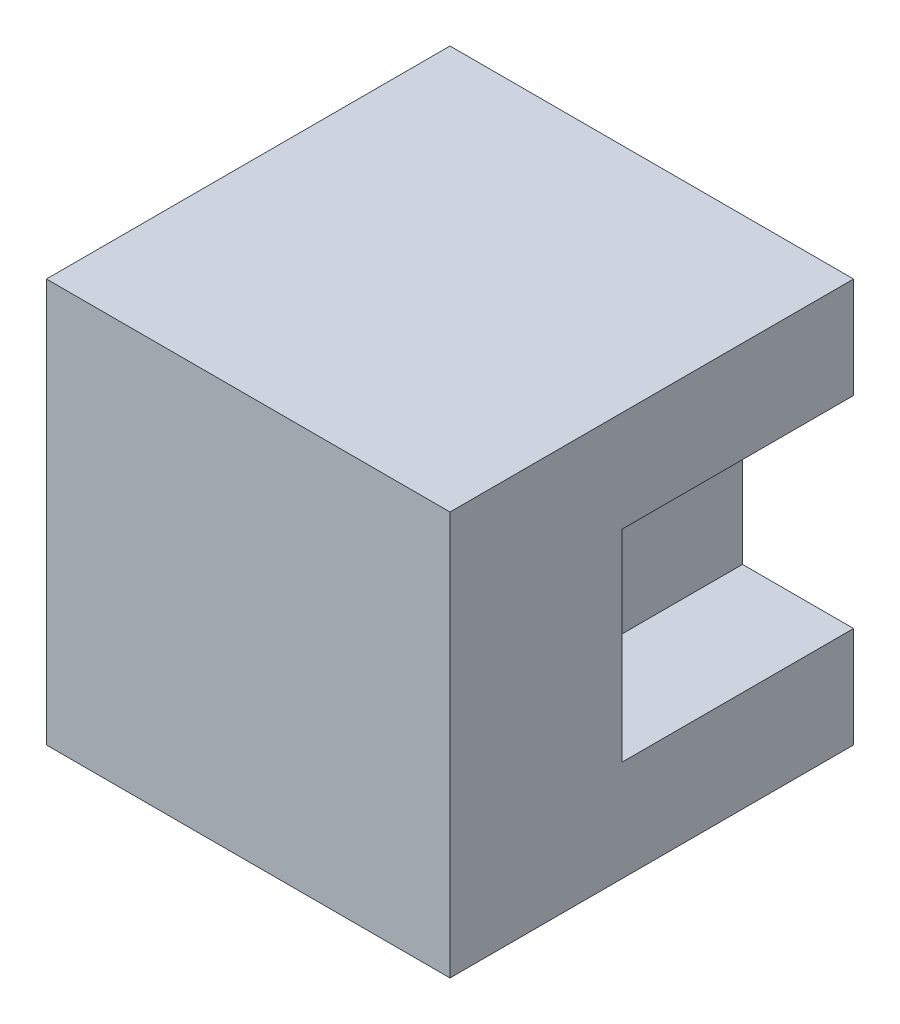
ISO-10303-21;
HEADER;
FILE_DESCRIPTION(('STEP AP214'),'2;1');
FILE_NAME('part.step','',(''),(''),'','','');
FILE_SCHEMA(('AUTOMOTIVE_DESIGN { 1 0 10303 214 1 1 1 1 }'));
ENDSEC;
DATA;
#1=APPLICATION_CONTEXT('core data for automotive mechanical design processes');
#2=APPLICATION_PROTOCOL_DEFINITION('international standard','automotive_design',2000,#1);
#3=PRODUCT_CONTEXT('',#1,'mechanical');
#4=PRODUCT('Part','Part','',(#3));
#5=PRODUCT_RELATED_PRODUCT_CATEGORY('part','',(#4));
#6=PRODUCT_DEFINITION_FORMATION('','',#4);
#7=PRODUCT_DEFINITION_CONTEXT('part definition',#1,'design');
#8=PRODUCT_DEFINITION('design','',#6,#7);
#9=PRODUCT_DEFINITION_SHAPE('','',#8);
#10=(LENGTH_UNIT() NAMED_UNIT(*) SI_UNIT(.MILLI.,.METRE.));
#11=(NAMED_UNIT(*) PLANE_ANGLE_UNIT() SI_UNIT($,.RADIAN.));
#12=(NAMED_UNIT(*) SI_UNIT($,.STERADIAN.) SOLID_ANGLE_UNIT());
#13=UNCERTAINTY_MEASURE_WITH_UNIT(LENGTH_MEASURE(1.E-05),#10,'distance_accuracy_value','');
#14=(GEOMETRIC_REPRESENTATION_CONTEXT(3) GLOBAL_UNCERTAINTY_ASSIGNED_CONTEXT((#13)) GLOBAL_UNIT_ASSIGNED_CONTEXT((#10,
#11,#12)) REPRESENTATION_CONTEXT('',''));
#15=CARTESIAN_POINT('',(0.,0.,0.));
#16=DIRECTION('',(0.,0.,1.));
#17=DIRECTION('',(1.,0.,0.));
#18=AXIS2_PLACEMENT_3D('',#15,#16,#17);
#19=CARTESIAN_POINT('',(-10.,10.,10.));
#20=DIRECTION('',(1.,0.,0.));
#21=DIRECTION('',(0.,0.,-1.));
#22=AXIS2_PLACEMENT_3D('',#19,#20,#21);
#23=PLANE('',#22);
#24=DIRECTION('',(0.,0.,1.));
#25=VECTOR('',#24,1.);
#26=CARTESIAN_POINT('',(-10.,0.,10.));
#27=LINE('',#26,#25);
#28=CARTESIAN_POINT('',(-10.,0.,0.));
#29=VERTEX_POINT('',#28);
#30=CARTESIAN_POINT('',(-10.,0.,10.));
#31=VERTEX_POINT('',#30);
#32=EDGE_CURVE('E135',#29,#31,#27,.T.);
#33=ORIENTED_EDGE('',*,*,#32,.T.);
#34=DIRECTION('',(0.,-1.,0.));
#35=VECTOR('',#34,1.);
#36=CARTESIAN_POINT('',(-10.,10.,10.));
#37=LINE('',#36,#35);
#38=CARTESIAN_POINT('',(-10.,10.,10.));
#39=VERTEX_POINT('',#38);
#40=EDGE_CURVE('E159',#39,#31,#37,.T.);
#41=ORIENTED_EDGE('',*,*,#40,.F.);
#42=DIRECTION('',(0.,0.,1.));
#43=VECTOR('',#42,1.);
#44=CARTESIAN_POINT('',(-10.,10.,10.));
#45=LINE('',#44,#43);
#46=CARTESIAN_POINT('',(-10.,10.,0.));
#47=VERTEX_POINT('',#46);
#48=EDGE_CURVE('E136',#47,#39,#45,.T.);
#49=ORIENTED_EDGE('',*,*,#48,.F.);
#50=DIRECTION('',(0.,-1.,0.));
#51=VECTOR('',#50,1.);
#52=CARTESIAN_POINT('',(-10.,10.,0.));
#53=LINE('',#52,#51);
#54=EDGE_CURVE('E142',#47,#29,#53,.T.);
#55=ORIENTED_EDGE('',*,*,#54,.T.);
#56=EDGE_LOOP('',(#33,#41,#49,#55));
#57=FACE_BOUND('',#56,.T.);
#58=ADVANCED_FACE('F34',(#57),#23,.F.);
#59=CARTESIAN_POINT('',(-10.,10.,10.));
#60=DIRECTION('',(0.,0.,-1.));
#61=DIRECTION('',(-1.,0.,0.));
#62=AXIS2_PLACEMENT_3D('',#59,#60,#61);
#63=PLANE('',#62);
#64=DIRECTION('',(1.,0.,0.));
#65=VECTOR('',#64,1.);
#66=CARTESIAN_POINT('',(-10.,0.,10.));
#67=LINE('',#66,#65);
#68=CARTESIAN_POINT('',(0.,0.,10.));
#69=VERTEX_POINT('',#68);
#70=EDGE_CURVE('E145',#31,#69,#67,.T.);
#71=ORIENTED_EDGE('',*,*,#70,.T.);
#72=DIRECTION('',(0.,-1.,0.));
#73=VECTOR('',#72,1.);
#74=CARTESIAN_POINT('',(0.,10.,10.));
#75=LINE('',#74,#73);
#76=CARTESIAN_POINT('',(0.,10.,10.));
#77=VERTEX_POINT('',#76);
#78=EDGE_CURVE('E156',#77,#69,#75,.T.);
#79=ORIENTED_EDGE('',*,*,#78,.F.);
#80=DIRECTION('',(1.,0.,0.));
#81=VECTOR('',#80,1.);
#82=CARTESIAN_POINT('',(-10.,10.,10.));
#83=LINE('',#82,#81);
#84=EDGE_CURVE('E85',#39,#77,#83,.T.);
#85=ORIENTED_EDGE('',*,*,#84,.F.);
#86=ORIENTED_EDGE('',*,*,#40,.T.);
#87=EDGE_LOOP('',(#71,#79,#85,#86));
#88=FACE_BOUND('',#87,.T.);
#89=ADVANCED_FACE('F179',(#88),#63,.F.);
#90=CARTESIAN_POINT('',(0.,10.,10.));
#91=DIRECTION('',(-1.,0.,0.));
#92=DIRECTION('',(0.,0.,1.));
#93=AXIS2_PLACEMENT_3D('',#90,#91,#92);
#94=PLANE('',#93);
#95=DIRECTION('',(0.,-1.,0.));
#96=VECTOR('',#95,1.);
#97=CARTESIAN_POINT('',(0.,10.,5.74303168974751));
#98=LINE('',#97,#96);
#99=CARTESIAN_POINT('',(0.,7.5,5.74303168974751));
#100=VERTEX_POINT('',#99);
#101=CARTESIAN_POINT('',(0.,2.5,5.74303168974751));
#102=VERTEX_POINT('',#101);
#103=EDGE_CURVE('E11',#100,#102,#98,.T.);
#104=ORIENTED_EDGE('',*,*,#103,.F.);
#105=DIRECTION('',(0.,0.,-1.));
#106=VECTOR('',#105,1.);
#107=CARTESIAN_POINT('',(0.,7.5,10.));
#108=LINE('',#107,#106);
#109=CARTESIAN_POINT('',(0.,7.5,0.));
#110=VERTEX_POINT('',#109);
#111=EDGE_CURVE('E123',#100,#110,#108,.T.);
#112=ORIENTED_EDGE('',*,*,#111,.T.);
#113=DIRECTION('',(0.,-1.,0.));
#114=VECTOR('',#113,1.);
#115=CARTESIAN_POINT('',(0.,10.,0.));
#116=LINE('',#115,#114);
#117=CARTESIAN_POINT('',(0.,10.,0.));
#118=VERTEX_POINT('',#117);
#119=EDGE_CURVE('E153',#118,#110,#116,.T.);
#120=ORIENTED_EDGE('',*,*,#119,.F.);
#121=DIRECTION('',(0.,0.,-1.));
#122=VECTOR('',#121,1.);
#123=CARTESIAN_POINT('',(0.,10.,10.));
#124=LINE('',#123,#122);
#125=EDGE_CURVE('E139',#77,#118,#124,.T.);
#126=ORIENTED_EDGE('',*,*,#125,.F.);
#127=ORIENTED_EDGE('',*,*,#78,.T.);
#128=DIRECTION('',(0.,0.,-1.));
#129=VECTOR('',#128,1.);
#130=CARTESIAN_POINT('',(0.,0.,10.));
#131=LINE('',#130,#129);
#132=CARTESIAN_POINT('',(0.,0.,0.));
#133=VERTEX_POINT('',#132);
#134=EDGE_CURVE('E147',#69,#133,#131,.T.);
#135=ORIENTED_EDGE('',*,*,#134,.T.);
#136=CARTESIAN_POINT('',(0.,2.5,0.));
#137=VERTEX_POINT('',#136);
#138=EDGE_CURVE('E152',#137,#133,#116,.T.);
#139=ORIENTED_EDGE('',*,*,#138,.F.);
#140=DIRECTION('',(0.,0.,-1.));
#141=VECTOR('',#140,1.);
#142=CARTESIAN_POINT('',(0.,2.5,10.));
#143=LINE('',#142,#141);
#144=EDGE_CURVE('E48',#102,#137,#143,.T.);
#145=ORIENTED_EDGE('',*,*,#144,.F.);
#146=EDGE_LOOP('',(#104,#112,#120,#126,#127,#135,#139,#145));
#147=FACE_BOUND('',#146,.T.);
#148=ADVANCED_FACE('F166',(#147),#94,.F.);
#149=CARTESIAN_POINT('',(-10.,10.,0.));
#150=DIRECTION('',(0.,0.,1.));
#151=DIRECTION('',(1.,0.,0.));
#152=AXIS2_PLACEMENT_3D('',#149,#150,#151);
#153=PLANE('',#152);
#154=ORIENTED_EDGE('',*,*,#119,.T.);
#155=DIRECTION('',(-1.,0.,0.));
#156=VECTOR('',#155,1.);
#157=CARTESIAN_POINT('',(-10.,7.5,0.));
#158=LINE('',#157,#156);
#159=CARTESIAN_POINT('',(-2.75181442294586,7.5,0.));
#160=VERTEX_POINT('',#159);
#161=EDGE_CURVE('E41',#110,#160,#158,.T.);
#162=ORIENTED_EDGE('',*,*,#161,.T.);
#163=DIRECTION('',(0.,1.,0.));
#164=VECTOR('',#163,1.);
#165=CARTESIAN_POINT('',(-2.75181442294586,10.,0.));
#166=LINE('',#165,#164);
#167=CARTESIAN_POINT('',(-2.75181442294586,2.5,0.));
#168=VERTEX_POINT('',#167);
#169=EDGE_CURVE('E114',#168,#160,#166,.T.);
#170=ORIENTED_EDGE('',*,*,#169,.F.);
#171=DIRECTION('',(-1.,0.,0.));
#172=VECTOR('',#171,1.);
#173=CARTESIAN_POINT('',(-10.,2.5,0.));
#174=LINE('',#173,#172);
#175=EDGE_CURVE('E161',#137,#168,#174,.T.);
#176=ORIENTED_EDGE('',*,*,#175,.F.);
#177=ORIENTED_EDGE('',*,*,#138,.T.);
#178=DIRECTION('',(-1.,0.,0.));
#179=VECTOR('',#178,1.);
#180=CARTESIAN_POINT('',(-10.,0.,0.));
#181=LINE('',#180,#179);
#182=EDGE_CURVE('E77',#133,#29,#181,.T.);
#183=ORIENTED_EDGE('',*,*,#182,.T.);
#184=ORIENTED_EDGE('',*,*,#54,.F.);
#185=DIRECTION('',(-1.,0.,0.));
#186=VECTOR('',#185,1.);
#187=CARTESIAN_POINT('',(-10.,10.,0.));
#188=LINE('',#187,#186);
#189=EDGE_CURVE('E57',#118,#47,#188,.T.);
#190=ORIENTED_EDGE('',*,*,#189,.F.);
#191=EDGE_LOOP('',(#154,#162,#170,#176,#177,#183,#184,#190));
#192=FACE_BOUND('',#191,.T.);
#193=ADVANCED_FACE('F163',(#192),#153,.F.);
#194=CARTESIAN_POINT('',(0.,10.,0.));
#195=DIRECTION('',(0.,-1.,0.));
#196=DIRECTION('',(0.,0.,-1.));
#197=AXIS2_PLACEMENT_3D('',#194,#195,#196);
#198=PLANE('',#197);
#199=ORIENTED_EDGE('',*,*,#48,.T.);
#200=ORIENTED_EDGE('',*,*,#84,.T.);
#201=ORIENTED_EDGE('',*,*,#125,.T.);
#202=ORIENTED_EDGE('',*,*,#189,.T.);
#203=EDGE_LOOP('',(#199,#200,#201,#202));
#204=FACE_BOUND('',#203,.T.);
#205=ADVANCED_FACE('F178',(#204),#198,.F.);
#206=CARTESIAN_POINT('',(0.,0.,0.));
#207=DIRECTION('',(0.,-1.,0.));
#208=DIRECTION('',(0.,0.,-1.));
#209=AXIS2_PLACEMENT_3D('',#206,#207,#208);
#210=PLANE('',#209);
#211=ORIENTED_EDGE('',*,*,#32,.F.);
#212=ORIENTED_EDGE('',*,*,#182,.F.);
#213=ORIENTED_EDGE('',*,*,#134,.F.);
#214=ORIENTED_EDGE('',*,*,#70,.F.);
#215=EDGE_LOOP('',(#211,#212,#213,#214));
#216=FACE_BOUND('',#215,.T.);
#217=ADVANCED_FACE('F174',(#216),#210,.T.);
#218=CARTESIAN_POINT('',(-2.75181442294586,7.5,5.74303168974751));
#219=DIRECTION('',(0.,0.,-1.));
#220=DIRECTION('',(-1.,0.,0.));
#221=AXIS2_PLACEMENT_3D('',#218,#219,#220);
#222=PLANE('',#221);
#223=ORIENTED_EDGE('',*,*,#103,.T.);
#224=DIRECTION('',(1.,0.,0.));
#225=VECTOR('',#224,1.);
#226=CARTESIAN_POINT('',(-2.75181442294586,2.5,5.74303168974751));
#227=LINE('',#226,#225);
#228=CARTESIAN_POINT('',(-2.75181442294586,2.5,5.74303168974751));
#229=VERTEX_POINT('',#228);
#230=EDGE_CURVE('E118',#229,#102,#227,.T.);
#231=ORIENTED_EDGE('',*,*,#230,.F.);
#232=DIRECTION('',(0.,-1.,0.));
#233=VECTOR('',#232,1.);
#234=CARTESIAN_POINT('',(-2.75181442294586,7.5,5.74303168974751));
#235=LINE('',#234,#233);
#236=CARTESIAN_POINT('',(-2.75181442294586,7.5,5.74303168974751));
#237=VERTEX_POINT('',#236);
#238=EDGE_CURVE('E112',#237,#229,#235,.T.);
#239=ORIENTED_EDGE('',*,*,#238,.F.);
#240=DIRECTION('',(1.,0.,0.));
#241=VECTOR('',#240,1.);
#242=CARTESIAN_POINT('',(-2.75181442294586,7.5,5.74303168974751));
#243=LINE('',#242,#241);
#244=EDGE_CURVE('E117',#237,#100,#243,.T.);
#245=ORIENTED_EDGE('',*,*,#244,.T.);
#246=EDGE_LOOP('',(#223,#231,#239,#245));
#247=FACE_BOUND('',#246,.T.);
#248=ADVANCED_FACE('F128',(#247),#222,.T.);
#249=CARTESIAN_POINT('',(-2.75181442294586,7.5,-15.8819058800229));
#250=DIRECTION('',(1.,0.,0.));
#251=DIRECTION('',(0.,0.,-1.));
#252=AXIS2_PLACEMENT_3D('',#249,#250,#251);
#253=PLANE('',#252);
#254=ORIENTED_EDGE('',*,*,#169,.T.);
#255=DIRECTION('',(0.,0.,1.));
#256=VECTOR('',#255,1.);
#257=CARTESIAN_POINT('',(-2.75181442294586,7.5,-15.8819058800229));
#258=LINE('',#257,#256);
#259=EDGE_CURVE('E107',#160,#237,#258,.T.);
#260=ORIENTED_EDGE('',*,*,#259,.T.);
#261=ORIENTED_EDGE('',*,*,#238,.T.);
#262=DIRECTION('',(0.,0.,1.));
#263=VECTOR('',#262,1.);
#264=CARTESIAN_POINT('',(-2.75181442294586,2.5,-15.8819058800229));
#265=LINE('',#264,#263);
#266=EDGE_CURVE('E170',#168,#229,#265,.T.);
#267=ORIENTED_EDGE('',*,*,#266,.F.);
#268=EDGE_LOOP('',(#254,#260,#261,#267));
#269=FACE_BOUND('',#268,.T.);
#270=ADVANCED_FACE('F109',(#269),#253,.T.);
#271=CARTESIAN_POINT('',(0.,7.5,0.));
#272=DIRECTION('',(0.,1.,0.));
#273=DIRECTION('',(0.,0.,1.));
#274=AXIS2_PLACEMENT_3D('',#271,#272,#273);
#275=PLANE('',#274);
#276=ORIENTED_EDGE('',*,*,#244,.F.);
#277=ORIENTED_EDGE('',*,*,#259,.F.);
#278=ORIENTED_EDGE('',*,*,#161,.F.);
#279=ORIENTED_EDGE('',*,*,#111,.F.);
#280=EDGE_LOOP('',(#276,#277,#278,#279));
#281=FACE_BOUND('',#280,.T.);
#282=ADVANCED_FACE('F121',(#281),#275,.F.);
#283=CARTESIAN_POINT('',(0.,2.5,0.));
#284=DIRECTION('',(0.,1.,0.));
#285=DIRECTION('',(0.,0.,1.));
#286=AXIS2_PLACEMENT_3D('',#283,#284,#285);
#287=PLANE('',#286);
#288=ORIENTED_EDGE('',*,*,#144,.T.);
#289=ORIENTED_EDGE('',*,*,#175,.T.);
#290=ORIENTED_EDGE('',*,*,#266,.T.);
#291=ORIENTED_EDGE('',*,*,#230,.T.);
#292=EDGE_LOOP('',(#288,#289,#290,#291));
#293=FACE_BOUND('',#292,.T.);
#294=ADVANCED_FACE('F169',(#293),#287,.T.);
#295=CLOSED_SHELL('',(#58,#89,#148,#193,#205,#217,#248,#270,#282,#294));
#296=MANIFOLD_SOLID_BREP('B2',#295);
#297=ADVANCED_BREP_SHAPE_REPRESENTATION('',(#18,#296),#14);
#298=SHAPE_DEFINITION_REPRESENTATION(#9,#297);
ENDSEC;
END-ISO-10303-21;
